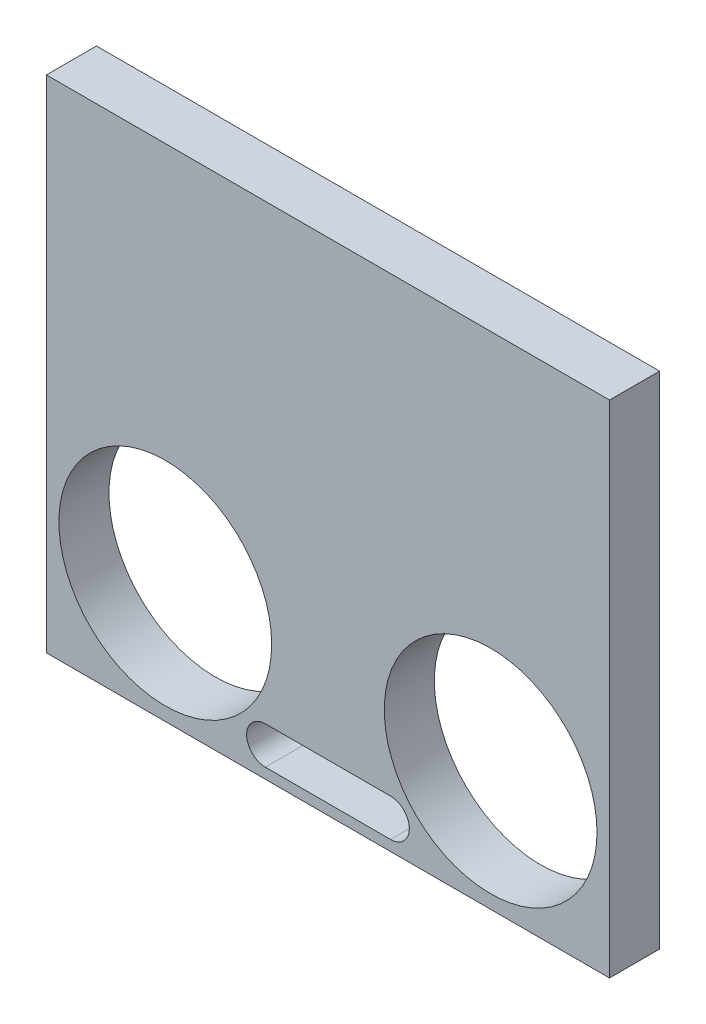
ISO-10303-21;
HEADER;
FILE_DESCRIPTION(('STEP AP214'),'2;1');
FILE_NAME('part.step','',(''),(''),'','','');
FILE_SCHEMA(('AUTOMOTIVE_DESIGN { 1 0 10303 214 1 1 1 1 }'));
ENDSEC;
DATA;
#1=APPLICATION_CONTEXT('core data for automotive mechanical design processes');
#2=APPLICATION_PROTOCOL_DEFINITION('international standard','automotive_design',2000,#1);
#3=PRODUCT_CONTEXT('',#1,'mechanical');
#4=PRODUCT('Part','Part','',(#3));
#5=PRODUCT_RELATED_PRODUCT_CATEGORY('part','',(#4));
#6=PRODUCT_DEFINITION_FORMATION('','',#4);
#7=PRODUCT_DEFINITION_CONTEXT('part definition',#1,'design');
#8=PRODUCT_DEFINITION('design','',#6,#7);
#9=PRODUCT_DEFINITION_SHAPE('','',#8);
#10=(LENGTH_UNIT() NAMED_UNIT(*) SI_UNIT(.MILLI.,.METRE.));
#11=(NAMED_UNIT(*) PLANE_ANGLE_UNIT() SI_UNIT($,.RADIAN.));
#12=(NAMED_UNIT(*) SI_UNIT($,.STERADIAN.) SOLID_ANGLE_UNIT());
#13=UNCERTAINTY_MEASURE_WITH_UNIT(LENGTH_MEASURE(1.E-05),#10,'distance_accuracy_value','');
#14=(GEOMETRIC_REPRESENTATION_CONTEXT(3) GLOBAL_UNCERTAINTY_ASSIGNED_CONTEXT((#13)) GLOBAL_UNIT_ASSIGNED_CONTEXT((#10,
#11,#12)) REPRESENTATION_CONTEXT('',''));
#15=CARTESIAN_POINT('',(0.,0.,0.));
#16=DIRECTION('',(0.,0.,1.));
#17=DIRECTION('',(1.,0.,0.));
#18=AXIS2_PLACEMENT_3D('',#15,#16,#17);
#19=CARTESIAN_POINT('',(0.,0.,4.));
#20=DIRECTION('',(0.,0.,1.));
#21=DIRECTION('',(1.,0.,0.));
#22=AXIS2_PLACEMENT_3D('',#19,#20,#21);
#23=PLANE('',#22);
#24=CARTESIAN_POINT('',(22.0601259543231,-8.43064943247072,4.));
#25=DIRECTION('',(0.,0.,1.));
#26=DIRECTION('',(1.,0.,0.));
#27=AXIS2_PLACEMENT_3D('',#24,#25,#26);
#28=CIRCLE('',#27,8.50000000000001);
#29=CARTESIAN_POINT('',(30.5601259543231,-8.43064943247072,4.));
#30=VERTEX_POINT('',#29);
#31=EDGE_CURVE('E142',#30,#30,#28,.T.);
#32=ORIENTED_EDGE('',*,*,#31,.F.);
#33=EDGE_LOOP('',(#32));
#34=FACE_BOUND('',#33,.T.);
#35=DIRECTION('',(0.,-1.,0.));
#36=VECTOR('',#35,1.);
#37=CARTESIAN_POINT('',(-13.4398740456769,21.991341991342,4.));
#38=LINE('',#37,#36);
#39=CARTESIAN_POINT('',(-13.4398740456769,21.991341991342,4.));
#40=VERTEX_POINT('',#39);
#41=CARTESIAN_POINT('',(-13.4398740456769,-18.008658008658,4.));
#42=VERTEX_POINT('',#41);
#43=EDGE_CURVE('E148',#40,#42,#38,.T.);
#44=ORIENTED_EDGE('',*,*,#43,.T.);
#45=DIRECTION('',(1.,0.,0.));
#46=VECTOR('',#45,1.);
#47=CARTESIAN_POINT('',(-13.4398740456769,-18.008658008658,4.));
#48=LINE('',#47,#46);
#49=CARTESIAN_POINT('',(31.5601259543231,-18.008658008658,4.));
#50=VERTEX_POINT('',#49);
#51=EDGE_CURVE('E151',#42,#50,#48,.T.);
#52=ORIENTED_EDGE('',*,*,#51,.T.);
#53=DIRECTION('',(0.,1.,0.));
#54=VECTOR('',#53,1.);
#55=CARTESIAN_POINT('',(31.5601259543231,21.991341991342,4.));
#56=LINE('',#55,#54);
#57=CARTESIAN_POINT('',(31.5601259543231,21.991341991342,4.));
#58=VERTEX_POINT('',#57);
#59=EDGE_CURVE('E154',#50,#58,#56,.T.);
#60=ORIENTED_EDGE('',*,*,#59,.T.);
#61=DIRECTION('',(-1.,0.,0.));
#62=VECTOR('',#61,1.);
#63=CARTESIAN_POINT('',(-13.4398740456769,21.991341991342,4.));
#64=LINE('',#63,#62);
#65=EDGE_CURVE('E156',#58,#40,#64,.T.);
#66=ORIENTED_EDGE('',*,*,#65,.T.);
#67=EDGE_LOOP('',(#44,#52,#60,#66));
#68=FACE_BOUND('',#67,.T.);
#69=CARTESIAN_POINT('',(-3.93987404567692,-8.43064943247072,4.));
#70=DIRECTION('',(0.,0.,1.));
#71=DIRECTION('',(1.,0.,0.));
#72=AXIS2_PLACEMENT_3D('',#69,#70,#71);
#73=CIRCLE('',#72,8.5);
#74=CARTESIAN_POINT('',(4.56012595432308,-8.43064943247072,4.));
#75=VERTEX_POINT('',#74);
#76=EDGE_CURVE('E136',#75,#75,#73,.T.);
#77=ORIENTED_EDGE('',*,*,#76,.F.);
#78=EDGE_LOOP('',(#77));
#79=FACE_BOUND('',#78,.T.);
#80=DIRECTION('',(1.,0.,0.));
#81=VECTOR('',#80,1.);
#82=CARTESIAN_POINT('',(4.06012595432308,-17.1698735750579,4.));
#83=LINE('',#82,#81);
#84=CARTESIAN_POINT('',(4.06012595432308,-17.1698735750579,4.));
#85=VERTEX_POINT('',#84);
#86=CARTESIAN_POINT('',(14.0601259543231,-17.1698735750579,4.));
#87=VERTEX_POINT('',#86);
#88=EDGE_CURVE('E108',#85,#87,#83,.T.);
#89=ORIENTED_EDGE('',*,*,#88,.F.);
#90=CARTESIAN_POINT('',(4.06012595432308,-15.6698735750579,4.));
#91=DIRECTION('',(0.,0.,1.));
#92=DIRECTION('',(1.,0.,0.));
#93=AXIS2_PLACEMENT_3D('',#90,#91,#92);
#94=CIRCLE('',#93,1.5);
#95=CARTESIAN_POINT('',(4.06012595432308,-14.1698735750579,4.));
#96=VERTEX_POINT('',#95);
#97=EDGE_CURVE('E100',#96,#85,#94,.T.);
#98=ORIENTED_EDGE('',*,*,#97,.F.);
#99=DIRECTION('',(-1.,0.,0.));
#100=VECTOR('',#99,1.);
#101=CARTESIAN_POINT('',(4.06012595432308,-14.1698735750579,4.));
#102=LINE('',#101,#100);
#103=CARTESIAN_POINT('',(14.0601259543231,-14.1698735750579,4.));
#104=VERTEX_POINT('',#103);
#105=EDGE_CURVE('E122',#104,#96,#102,.T.);
#106=ORIENTED_EDGE('',*,*,#105,.F.);
#107=CARTESIAN_POINT('',(14.0601259543231,-15.6698735750579,4.));
#108=DIRECTION('',(0.,0.,1.));
#109=DIRECTION('',(1.,0.,0.));
#110=AXIS2_PLACEMENT_3D('',#107,#108,#109);
#111=CIRCLE('',#110,1.5);
#112=EDGE_CURVE('E120',#87,#104,#111,.T.);
#113=ORIENTED_EDGE('',*,*,#112,.F.);
#114=EDGE_LOOP('',(#89,#98,#106,#113));
#115=FACE_BOUND('',#114,.T.);
#116=ADVANCED_FACE('F35',(#34,#68,#79,#115),#23,.T.);
#117=CARTESIAN_POINT('',(0.,0.,0.));
#118=DIRECTION('',(0.,0.,1.));
#119=DIRECTION('',(1.,0.,0.));
#120=AXIS2_PLACEMENT_3D('',#117,#118,#119);
#121=PLANE('',#120);
#122=CARTESIAN_POINT('',(-3.93987404567692,-8.43064943247072,0.));
#123=DIRECTION('',(0.,0.,1.));
#124=DIRECTION('',(1.,0.,0.));
#125=AXIS2_PLACEMENT_3D('',#122,#123,#124);
#126=CIRCLE('',#125,8.5);
#127=CARTESIAN_POINT('',(4.56012595432308,-8.43064943247072,0.));
#128=VERTEX_POINT('',#127);
#129=EDGE_CURVE('E116',#128,#128,#126,.T.);
#130=ORIENTED_EDGE('',*,*,#129,.T.);
#131=EDGE_LOOP('',(#130));
#132=FACE_BOUND('',#131,.T.);
#133=CARTESIAN_POINT('',(22.0601259543231,-8.43064943247072,0.));
#134=DIRECTION('',(0.,0.,1.));
#135=DIRECTION('',(1.,0.,0.));
#136=AXIS2_PLACEMENT_3D('',#133,#134,#135);
#137=CIRCLE('',#136,8.50000000000001);
#138=CARTESIAN_POINT('',(30.5601259543231,-8.43064943247072,0.));
#139=VERTEX_POINT('',#138);
#140=EDGE_CURVE('E139',#139,#139,#137,.T.);
#141=ORIENTED_EDGE('',*,*,#140,.T.);
#142=EDGE_LOOP('',(#141));
#143=FACE_BOUND('',#142,.T.);
#144=DIRECTION('',(0.,-1.,0.));
#145=VECTOR('',#144,1.);
#146=CARTESIAN_POINT('',(-13.4398740456769,21.991341991342,0.));
#147=LINE('',#146,#145);
#148=CARTESIAN_POINT('',(-13.4398740456769,21.991341991342,0.));
#149=VERTEX_POINT('',#148);
#150=CARTESIAN_POINT('',(-13.4398740456769,-18.008658008658,0.));
#151=VERTEX_POINT('',#150);
#152=EDGE_CURVE('E145',#149,#151,#147,.T.);
#153=ORIENTED_EDGE('',*,*,#152,.F.);
#154=DIRECTION('',(-1.,0.,0.));
#155=VECTOR('',#154,1.);
#156=CARTESIAN_POINT('',(-13.4398740456769,21.991341991342,0.));
#157=LINE('',#156,#155);
#158=CARTESIAN_POINT('',(31.5601259543231,21.991341991342,0.));
#159=VERTEX_POINT('',#158);
#160=EDGE_CURVE('E152',#159,#149,#157,.T.);
#161=ORIENTED_EDGE('',*,*,#160,.F.);
#162=DIRECTION('',(0.,1.,0.));
#163=VECTOR('',#162,1.);
#164=CARTESIAN_POINT('',(31.5601259543231,21.991341991342,0.));
#165=LINE('',#164,#163);
#166=CARTESIAN_POINT('',(31.5601259543231,-18.008658008658,0.));
#167=VERTEX_POINT('',#166);
#168=EDGE_CURVE('E163',#167,#159,#165,.T.);
#169=ORIENTED_EDGE('',*,*,#168,.F.);
#170=DIRECTION('',(1.,0.,0.));
#171=VECTOR('',#170,1.);
#172=CARTESIAN_POINT('',(-13.4398740456769,-18.008658008658,0.));
#173=LINE('',#172,#171);
#174=EDGE_CURVE('E161',#151,#167,#173,.T.);
#175=ORIENTED_EDGE('',*,*,#174,.F.);
#176=EDGE_LOOP('',(#153,#161,#169,#175));
#177=FACE_BOUND('',#176,.T.);
#178=CARTESIAN_POINT('',(4.06012595432308,-15.6698735750579,0.));
#179=DIRECTION('',(0.,0.,1.));
#180=DIRECTION('',(1.,0.,0.));
#181=AXIS2_PLACEMENT_3D('',#178,#179,#180);
#182=CIRCLE('',#181,1.5);
#183=CARTESIAN_POINT('',(4.06012595432308,-14.1698735750579,0.));
#184=VERTEX_POINT('',#183);
#185=CARTESIAN_POINT('',(4.06012595432308,-17.1698735750579,0.));
#186=VERTEX_POINT('',#185);
#187=EDGE_CURVE('E58',#184,#186,#182,.T.);
#188=ORIENTED_EDGE('',*,*,#187,.T.);
#189=DIRECTION('',(1.,0.,0.));
#190=VECTOR('',#189,1.);
#191=CARTESIAN_POINT('',(4.06012595432308,-17.1698735750579,0.));
#192=LINE('',#191,#190);
#193=CARTESIAN_POINT('',(14.0601259543231,-17.1698735750579,0.));
#194=VERTEX_POINT('',#193);
#195=EDGE_CURVE('E115',#186,#194,#192,.T.);
#196=ORIENTED_EDGE('',*,*,#195,.T.);
#197=CARTESIAN_POINT('',(14.0601259543231,-15.6698735750579,0.));
#198=DIRECTION('',(0.,0.,1.));
#199=DIRECTION('',(1.,0.,0.));
#200=AXIS2_PLACEMENT_3D('',#197,#198,#199);
#201=CIRCLE('',#200,1.5);
#202=CARTESIAN_POINT('',(14.0601259543231,-14.1698735750579,0.));
#203=VERTEX_POINT('',#202);
#204=EDGE_CURVE('E128',#194,#203,#201,.T.);
#205=ORIENTED_EDGE('',*,*,#204,.T.);
#206=DIRECTION('',(-1.,0.,0.));
#207=VECTOR('',#206,1.);
#208=CARTESIAN_POINT('',(4.06012595432308,-14.1698735750579,0.));
#209=LINE('',#208,#207);
#210=EDGE_CURVE('E109',#203,#184,#209,.T.);
#211=ORIENTED_EDGE('',*,*,#210,.T.);
#212=EDGE_LOOP('',(#188,#196,#205,#211));
#213=FACE_BOUND('',#212,.T.);
#214=ADVANCED_FACE('F181',(#132,#143,#177,#213),#121,.F.);
#215=CARTESIAN_POINT('',(-13.4398740456769,21.991341991342,4.));
#216=DIRECTION('',(1.,0.,0.));
#217=DIRECTION('',(0.,1.,0.));
#218=AXIS2_PLACEMENT_3D('',#215,#216,#217);
#219=PLANE('',#218);
#220=ORIENTED_EDGE('',*,*,#152,.T.);
#221=DIRECTION('',(0.,0.,-1.));
#222=VECTOR('',#221,1.);
#223=CARTESIAN_POINT('',(-13.4398740456769,-18.008658008658,4.));
#224=LINE('',#223,#222);
#225=EDGE_CURVE('E11',#42,#151,#224,.T.);
#226=ORIENTED_EDGE('',*,*,#225,.F.);
#227=ORIENTED_EDGE('',*,*,#43,.F.);
#228=DIRECTION('',(0.,0.,-1.));
#229=VECTOR('',#228,1.);
#230=CARTESIAN_POINT('',(-13.4398740456769,21.991341991342,4.));
#231=LINE('',#230,#229);
#232=EDGE_CURVE('E158',#40,#149,#231,.T.);
#233=ORIENTED_EDGE('',*,*,#232,.T.);
#234=EDGE_LOOP('',(#220,#226,#227,#233));
#235=FACE_BOUND('',#234,.T.);
#236=ADVANCED_FACE('F37',(#235),#219,.F.);
#237=CARTESIAN_POINT('',(-13.4398740456769,-18.008658008658,4.));
#238=DIRECTION('',(0.,1.,0.));
#239=DIRECTION('',(0.,0.,1.));
#240=AXIS2_PLACEMENT_3D('',#237,#238,#239);
#241=PLANE('',#240);
#242=ORIENTED_EDGE('',*,*,#174,.T.);
#243=DIRECTION('',(0.,0.,-1.));
#244=VECTOR('',#243,1.);
#245=CARTESIAN_POINT('',(31.5601259543231,-18.008658008658,4.));
#246=LINE('',#245,#244);
#247=EDGE_CURVE('E43',#50,#167,#246,.T.);
#248=ORIENTED_EDGE('',*,*,#247,.F.);
#249=ORIENTED_EDGE('',*,*,#51,.F.);
#250=ORIENTED_EDGE('',*,*,#225,.T.);
#251=EDGE_LOOP('',(#242,#248,#249,#250));
#252=FACE_BOUND('',#251,.T.);
#253=ADVANCED_FACE('F192',(#252),#241,.F.);
#254=CARTESIAN_POINT('',(31.5601259543231,21.991341991342,4.));
#255=DIRECTION('',(-1.,0.,0.));
#256=DIRECTION('',(0.,-1.,0.));
#257=AXIS2_PLACEMENT_3D('',#254,#255,#256);
#258=PLANE('',#257);
#259=ORIENTED_EDGE('',*,*,#168,.T.);
#260=DIRECTION('',(0.,0.,-1.));
#261=VECTOR('',#260,1.);
#262=CARTESIAN_POINT('',(31.5601259543231,21.991341991342,4.));
#263=LINE('',#262,#261);
#264=EDGE_CURVE('E168',#58,#159,#263,.T.);
#265=ORIENTED_EDGE('',*,*,#264,.F.);
#266=ORIENTED_EDGE('',*,*,#59,.F.);
#267=ORIENTED_EDGE('',*,*,#247,.T.);
#268=EDGE_LOOP('',(#259,#265,#266,#267));
#269=FACE_BOUND('',#268,.T.);
#270=ADVANCED_FACE('F175',(#269),#258,.F.);
#271=CARTESIAN_POINT('',(-13.4398740456769,21.991341991342,4.));
#272=DIRECTION('',(0.,-1.,0.));
#273=DIRECTION('',(0.,0.,-1.));
#274=AXIS2_PLACEMENT_3D('',#271,#272,#273);
#275=PLANE('',#274);
#276=ORIENTED_EDGE('',*,*,#160,.T.);
#277=ORIENTED_EDGE('',*,*,#232,.F.);
#278=ORIENTED_EDGE('',*,*,#65,.F.);
#279=ORIENTED_EDGE('',*,*,#264,.T.);
#280=EDGE_LOOP('',(#276,#277,#278,#279));
#281=FACE_BOUND('',#280,.T.);
#282=ADVANCED_FACE('F185',(#281),#275,.F.);
#283=CARTESIAN_POINT('',(22.0601259543231,-8.43064943247072,4.));
#284=DIRECTION('',(0.,0.,-1.));
#285=DIRECTION('',(-1.,0.,0.));
#286=AXIS2_PLACEMENT_3D('',#283,#284,#285);
#287=CYLINDRICAL_SURFACE('',#286,8.50000000000001);
#288=ORIENTED_EDGE('',*,*,#31,.T.);
#289=EDGE_LOOP('',(#288));
#290=FACE_BOUND('',#289,.T.);
#291=ORIENTED_EDGE('',*,*,#140,.F.);
#292=EDGE_LOOP('',(#291));
#293=FACE_BOUND('',#292,.T.);
#294=ADVANCED_FACE('F209',(#290,#293),#287,.F.);
#295=CARTESIAN_POINT('',(-3.93987404567692,-8.43064943247072,4.));
#296=DIRECTION('',(0.,0.,-1.));
#297=DIRECTION('',(-1.,0.,0.));
#298=AXIS2_PLACEMENT_3D('',#295,#296,#297);
#299=CYLINDRICAL_SURFACE('',#298,8.5);
#300=ORIENTED_EDGE('',*,*,#76,.T.);
#301=EDGE_LOOP('',(#300));
#302=FACE_BOUND('',#301,.T.);
#303=ORIENTED_EDGE('',*,*,#129,.F.);
#304=EDGE_LOOP('',(#303));
#305=FACE_BOUND('',#304,.T.);
#306=ADVANCED_FACE('F216',(#302,#305),#299,.F.);
#307=CARTESIAN_POINT('',(4.06012595432308,-15.6698735750579,4.));
#308=DIRECTION('',(0.,0.,-1.));
#309=DIRECTION('',(-1.,0.,0.));
#310=AXIS2_PLACEMENT_3D('',#307,#308,#309);
#311=CYLINDRICAL_SURFACE('',#310,1.5);
#312=ORIENTED_EDGE('',*,*,#187,.F.);
#313=DIRECTION('',(0.,0.,-1.));
#314=VECTOR('',#313,1.);
#315=CARTESIAN_POINT('',(4.06012595432308,-14.1698735750579,4.));
#316=LINE('',#315,#314);
#317=EDGE_CURVE('E104',#96,#184,#316,.T.);
#318=ORIENTED_EDGE('',*,*,#317,.F.);
#319=ORIENTED_EDGE('',*,*,#97,.T.);
#320=DIRECTION('',(0.,0.,-1.));
#321=VECTOR('',#320,1.);
#322=CARTESIAN_POINT('',(4.06012595432308,-17.1698735750579,4.));
#323=LINE('',#322,#321);
#324=EDGE_CURVE('E103',#85,#186,#323,.T.);
#325=ORIENTED_EDGE('',*,*,#324,.T.);
#326=EDGE_LOOP('',(#312,#318,#319,#325));
#327=FACE_BOUND('',#326,.T.);
#328=ADVANCED_FACE('F102',(#327),#311,.F.);
#329=CARTESIAN_POINT('',(4.06012595432308,-17.1698735750579,4.));
#330=DIRECTION('',(0.,1.,0.));
#331=DIRECTION('',(-1.,0.,0.));
#332=AXIS2_PLACEMENT_3D('',#329,#330,#331);
#333=PLANE('',#332);
#334=ORIENTED_EDGE('',*,*,#195,.F.);
#335=ORIENTED_EDGE('',*,*,#324,.F.);
#336=ORIENTED_EDGE('',*,*,#88,.T.);
#337=DIRECTION('',(0.,0.,-1.));
#338=VECTOR('',#337,1.);
#339=CARTESIAN_POINT('',(14.0601259543231,-17.1698735750579,4.));
#340=LINE('',#339,#338);
#341=EDGE_CURVE('E117',#87,#194,#340,.T.);
#342=ORIENTED_EDGE('',*,*,#341,.T.);
#343=EDGE_LOOP('',(#334,#335,#336,#342));
#344=FACE_BOUND('',#343,.T.);
#345=ADVANCED_FACE('F112',(#344),#333,.T.);
#346=CARTESIAN_POINT('',(14.0601259543231,-15.6698735750579,4.));
#347=DIRECTION('',(0.,0.,-1.));
#348=DIRECTION('',(-1.,0.,0.));
#349=AXIS2_PLACEMENT_3D('',#346,#347,#348);
#350=CYLINDRICAL_SURFACE('',#349,1.5);
#351=ORIENTED_EDGE('',*,*,#204,.F.);
#352=ORIENTED_EDGE('',*,*,#341,.F.);
#353=ORIENTED_EDGE('',*,*,#112,.T.);
#354=DIRECTION('',(0.,0.,-1.));
#355=VECTOR('',#354,1.);
#356=CARTESIAN_POINT('',(14.0601259543231,-14.1698735750579,4.));
#357=LINE('',#356,#355);
#358=EDGE_CURVE('E50',#104,#203,#357,.T.);
#359=ORIENTED_EDGE('',*,*,#358,.T.);
#360=EDGE_LOOP('',(#351,#352,#353,#359));
#361=FACE_BOUND('',#360,.T.);
#362=ADVANCED_FACE('F233',(#361),#350,.F.);
#363=CARTESIAN_POINT('',(4.06012595432308,-14.1698735750579,4.));
#364=DIRECTION('',(0.,-1.,0.));
#365=DIRECTION('',(1.,0.,0.));
#366=AXIS2_PLACEMENT_3D('',#363,#364,#365);
#367=PLANE('',#366);
#368=ORIENTED_EDGE('',*,*,#210,.F.);
#369=ORIENTED_EDGE('',*,*,#358,.F.);
#370=ORIENTED_EDGE('',*,*,#105,.T.);
#371=ORIENTED_EDGE('',*,*,#317,.T.);
#372=EDGE_LOOP('',(#368,#369,#370,#371));
#373=FACE_BOUND('',#372,.T.);
#374=ADVANCED_FACE('F236',(#373),#367,.T.);
#375=CLOSED_SHELL('',(#116,#214,#236,#253,#270,#282,#294,#306,#328,#345,#362,#374));
#376=MANIFOLD_SOLID_BREP('B2',#375);
#377=ADVANCED_BREP_SHAPE_REPRESENTATION('',(#18,#376),#14);
#378=SHAPE_DEFINITION_REPRESENTATION(#9,#377);
ENDSEC;
END-ISO-10303-21;
